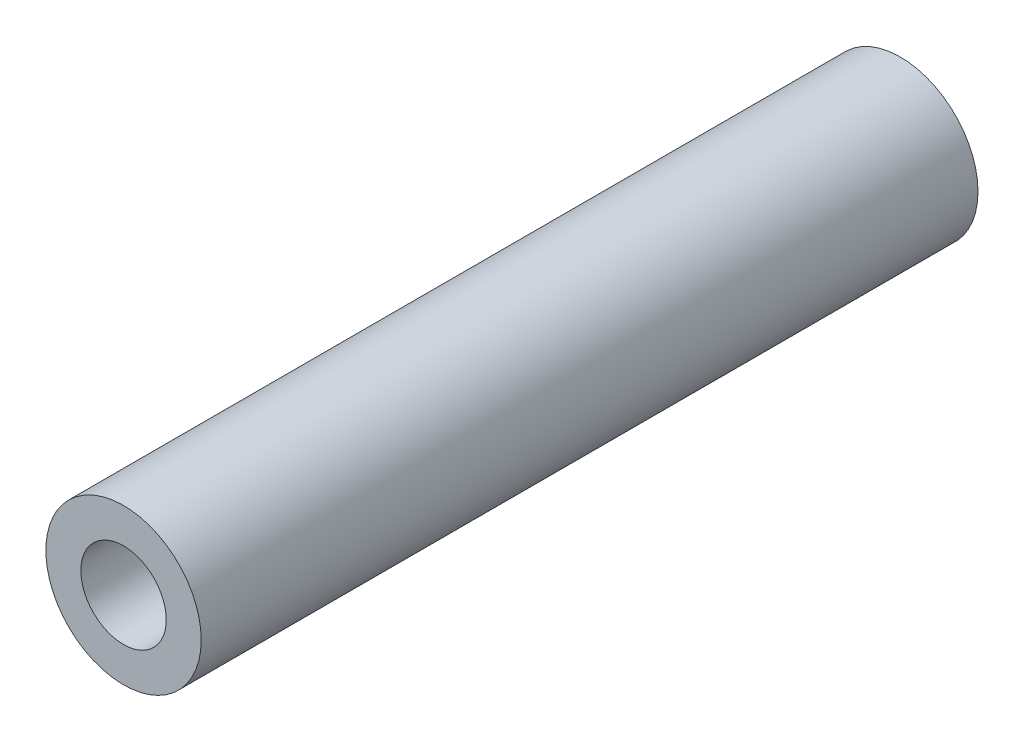
ISO-10303-21;
HEADER;
FILE_DESCRIPTION(('STEP AP214'),'2;1');
FILE_NAME('part.step','',(''),(''),'','','');
FILE_SCHEMA(('AUTOMOTIVE_DESIGN { 1 0 10303 214 1 1 1 1 }'));
ENDSEC;
DATA;
#1=APPLICATION_CONTEXT('core data for automotive mechanical design processes');
#2=APPLICATION_PROTOCOL_DEFINITION('international standard','automotive_design',2000,#1);
#3=PRODUCT_CONTEXT('',#1,'mechanical');
#4=PRODUCT('Part','Part','',(#3));
#5=PRODUCT_RELATED_PRODUCT_CATEGORY('part','',(#4));
#6=PRODUCT_DEFINITION_FORMATION('','',#4);
#7=PRODUCT_DEFINITION_CONTEXT('part definition',#1,'design');
#8=PRODUCT_DEFINITION('design','',#6,#7);
#9=PRODUCT_DEFINITION_SHAPE('','',#8);
#10=(LENGTH_UNIT() NAMED_UNIT(*) SI_UNIT(.MILLI.,.METRE.));
#11=(NAMED_UNIT(*) PLANE_ANGLE_UNIT() SI_UNIT($,.RADIAN.));
#12=(NAMED_UNIT(*) SI_UNIT($,.STERADIAN.) SOLID_ANGLE_UNIT());
#13=UNCERTAINTY_MEASURE_WITH_UNIT(LENGTH_MEASURE(1.E-05),#10,'distance_accuracy_value','');
#14=(GEOMETRIC_REPRESENTATION_CONTEXT(3) GLOBAL_UNCERTAINTY_ASSIGNED_CONTEXT((#13)) GLOBAL_UNIT_ASSIGNED_CONTEXT((#10,
#11,#12)) REPRESENTATION_CONTEXT('',''));
#15=CARTESIAN_POINT('',(0.,0.,0.));
#16=DIRECTION('',(0.,0.,1.));
#17=DIRECTION('',(1.,0.,0.));
#18=AXIS2_PLACEMENT_3D('',#15,#16,#17);
#19=CARTESIAN_POINT('',(0.,0.,15.));
#20=DIRECTION('',(0.,0.,1.));
#21=DIRECTION('',(1.,0.,0.));
#22=AXIS2_PLACEMENT_3D('',#19,#20,#21);
#23=PLANE('',#22);
#24=CARTESIAN_POINT('',(0.,0.,15.));
#25=DIRECTION('',(0.,0.,1.));
#26=DIRECTION('',(1.,0.,0.));
#27=AXIS2_PLACEMENT_3D('',#24,#25,#26);
#28=CIRCLE('',#27,3.);
#29=CARTESIAN_POINT('',(3.,0.,15.));
#30=VERTEX_POINT('',#29);
#31=EDGE_CURVE('E10',#30,#30,#28,.T.);
#32=ORIENTED_EDGE('',*,*,#31,.T.);
#33=EDGE_LOOP('',(#32));
#34=FACE_BOUND('',#33,.T.);
#35=CARTESIAN_POINT('',(0.,0.,15.));
#36=DIRECTION('',(0.,0.,1.));
#37=DIRECTION('',(1.,0.,0.));
#38=AXIS2_PLACEMENT_3D('',#35,#36,#37);
#39=CIRCLE('',#38,1.65);
#40=CARTESIAN_POINT('',(1.65,0.,15.));
#41=VERTEX_POINT('',#40);
#42=EDGE_CURVE('E48',#41,#41,#39,.T.);
#43=ORIENTED_EDGE('',*,*,#42,.F.);
#44=EDGE_LOOP('',(#43));
#45=FACE_BOUND('',#44,.T.);
#46=ADVANCED_FACE('F40',(#34,#45),#23,.T.);
#47=CARTESIAN_POINT('',(0.,0.,-15.));
#48=DIRECTION('',(0.,0.,1.));
#49=DIRECTION('',(1.,0.,0.));
#50=AXIS2_PLACEMENT_3D('',#47,#48,#49);
#51=PLANE('',#50);
#52=CARTESIAN_POINT('',(0.,0.,-15.));
#53=DIRECTION('',(0.,0.,1.));
#54=DIRECTION('',(1.,0.,0.));
#55=AXIS2_PLACEMENT_3D('',#52,#53,#54);
#56=CIRCLE('',#55,3.);
#57=CARTESIAN_POINT('',(3.,0.,-15.));
#58=VERTEX_POINT('',#57);
#59=EDGE_CURVE('E41',#58,#58,#56,.T.);
#60=ORIENTED_EDGE('',*,*,#59,.F.);
#61=EDGE_LOOP('',(#60));
#62=FACE_BOUND('',#61,.T.);
#63=CARTESIAN_POINT('',(0.,0.,-15.));
#64=DIRECTION('',(0.,0.,1.));
#65=DIRECTION('',(1.,0.,0.));
#66=AXIS2_PLACEMENT_3D('',#63,#64,#65);
#67=CIRCLE('',#66,1.65);
#68=CARTESIAN_POINT('',(1.65,0.,-15.));
#69=VERTEX_POINT('',#68);
#70=EDGE_CURVE('E49',#69,#69,#67,.T.);
#71=ORIENTED_EDGE('',*,*,#70,.T.);
#72=EDGE_LOOP('',(#71));
#73=FACE_BOUND('',#72,.T.);
#74=ADVANCED_FACE('F58',(#62,#73),#51,.F.);
#75=CARTESIAN_POINT('',(0.,0.,15.));
#76=DIRECTION('',(0.,0.,-1.));
#77=DIRECTION('',(-1.,0.,0.));
#78=AXIS2_PLACEMENT_3D('',#75,#76,#77);
#79=CYLINDRICAL_SURFACE('',#78,3.);
#80=ORIENTED_EDGE('',*,*,#31,.F.);
#81=EDGE_LOOP('',(#80));
#82=FACE_BOUND('',#81,.T.);
#83=ORIENTED_EDGE('',*,*,#59,.T.);
#84=EDGE_LOOP('',(#83));
#85=FACE_BOUND('',#84,.T.);
#86=ADVANCED_FACE('F39',(#82,#85),#79,.T.);
#87=CARTESIAN_POINT('',(0.,0.,15.));
#88=DIRECTION('',(0.,0.,-1.));
#89=DIRECTION('',(-1.,0.,0.));
#90=AXIS2_PLACEMENT_3D('',#87,#88,#89);
#91=CYLINDRICAL_SURFACE('',#90,1.65);
#92=ORIENTED_EDGE('',*,*,#42,.T.);
#93=EDGE_LOOP('',(#92));
#94=FACE_BOUND('',#93,.T.);
#95=ORIENTED_EDGE('',*,*,#70,.F.);
#96=EDGE_LOOP('',(#95));
#97=FACE_BOUND('',#96,.T.);
#98=ADVANCED_FACE('F57',(#94,#97),#91,.F.);
#99=CLOSED_SHELL('',(#46,#74,#86,#98));
#100=MANIFOLD_SOLID_BREP('B2',#99);
#101=ADVANCED_BREP_SHAPE_REPRESENTATION('',(#18,#100),#14);
#102=SHAPE_DEFINITION_REPRESENTATION(#9,#101);
ENDSEC;
END-ISO-10303-21;
